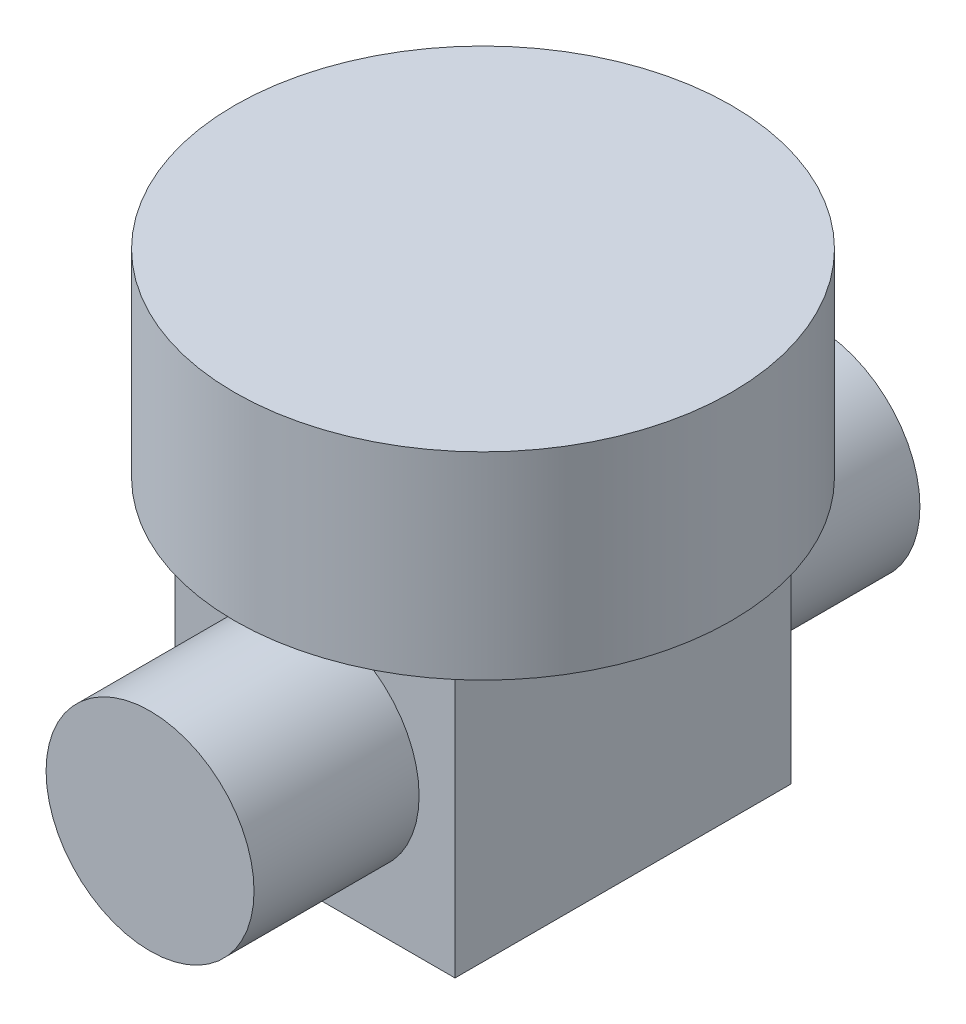
ISO-10303-21;
HEADER;
FILE_DESCRIPTION(('STEP AP214'),'2;1');
FILE_NAME('part.step','',(''),(''),'','','');
FILE_SCHEMA(('AUTOMOTIVE_DESIGN { 1 0 10303 214 1 1 1 1 }'));
ENDSEC;
DATA;
#1=APPLICATION_CONTEXT('core data for automotive mechanical design processes');
#2=APPLICATION_PROTOCOL_DEFINITION('international standard','automotive_design',2000,#1);
#3=PRODUCT_CONTEXT('',#1,'mechanical');
#4=PRODUCT('Part','Part','',(#3));
#5=PRODUCT_RELATED_PRODUCT_CATEGORY('part','',(#4));
#6=PRODUCT_DEFINITION_FORMATION('','',#4);
#7=PRODUCT_DEFINITION_CONTEXT('part definition',#1,'design');
#8=PRODUCT_DEFINITION('design','',#6,#7);
#9=PRODUCT_DEFINITION_SHAPE('','',#8);
#10=(LENGTH_UNIT() NAMED_UNIT(*) SI_UNIT(.MILLI.,.METRE.));
#11=(NAMED_UNIT(*) PLANE_ANGLE_UNIT() SI_UNIT($,.RADIAN.));
#12=(NAMED_UNIT(*) SI_UNIT($,.STERADIAN.) SOLID_ANGLE_UNIT());
#13=UNCERTAINTY_MEASURE_WITH_UNIT(LENGTH_MEASURE(1.E-05),#10,'distance_accuracy_value','');
#14=(GEOMETRIC_REPRESENTATION_CONTEXT(3) GLOBAL_UNCERTAINTY_ASSIGNED_CONTEXT((#13)) GLOBAL_UNIT_ASSIGNED_CONTEXT((#10,
#11,#12)) REPRESENTATION_CONTEXT('',''));
#15=CARTESIAN_POINT('',(0.,0.,0.));
#16=DIRECTION('',(0.,0.,1.));
#17=DIRECTION('',(1.,0.,0.));
#18=AXIS2_PLACEMENT_3D('',#15,#16,#17);
#19=CARTESIAN_POINT('',(-9.525,9.525,-11.43));
#20=DIRECTION('',(0.,0.,1.));
#21=DIRECTION('',(1.,0.,0.));
#22=AXIS2_PLACEMENT_3D('',#19,#20,#21);
#23=PLANE('',#22);
#24=DIRECTION('',(-1.,0.,0.));
#25=VECTOR('',#24,1.);
#26=CARTESIAN_POINT('',(-9.525,-9.525,-11.43));
#27=LINE('',#26,#25);
#28=CARTESIAN_POINT('',(9.525,-9.525,-11.43));
#29=VERTEX_POINT('',#28);
#30=CARTESIAN_POINT('',(-9.525,-9.525,-11.43));
#31=VERTEX_POINT('',#30);
#32=EDGE_CURVE('E104',#29,#31,#27,.T.);
#33=ORIENTED_EDGE('',*,*,#32,.T.);
#34=DIRECTION('',(0.,-1.,0.));
#35=VECTOR('',#34,1.);
#36=CARTESIAN_POINT('',(-9.525,9.525,-11.43));
#37=LINE('',#36,#35);
#38=CARTESIAN_POINT('',(-9.525,9.525,-11.43));
#39=VERTEX_POINT('',#38);
#40=EDGE_CURVE('E110',#39,#31,#37,.T.);
#41=ORIENTED_EDGE('',*,*,#40,.F.);
#42=DIRECTION('',(-1.,0.,0.));
#43=VECTOR('',#42,1.);
#44=CARTESIAN_POINT('',(-9.525,9.525,-11.43));
#45=LINE('',#44,#43);
#46=CARTESIAN_POINT('',(9.525,9.525,-11.43));
#47=VERTEX_POINT('',#46);
#48=EDGE_CURVE('E77',#47,#39,#45,.T.);
#49=ORIENTED_EDGE('',*,*,#48,.F.);
#50=DIRECTION('',(0.,-1.,0.));
#51=VECTOR('',#50,1.);
#52=CARTESIAN_POINT('',(9.525,9.525,-11.43));
#53=LINE('',#52,#51);
#54=EDGE_CURVE('E87',#47,#29,#53,.T.);
#55=ORIENTED_EDGE('',*,*,#54,.T.);
#56=EDGE_LOOP('',(#33,#41,#49,#55));
#57=FACE_BOUND('',#56,.T.);
#58=CARTESIAN_POINT('',(0.,0.,-11.43));
#59=DIRECTION('',(0.,0.,1.));
#60=DIRECTION('',(1.,0.,0.));
#61=AXIS2_PLACEMENT_3D('',#58,#59,#60);
#62=CIRCLE('',#61,7.08025);
#63=CARTESIAN_POINT('',(7.08025,0.,-11.43));
#64=VERTEX_POINT('',#63);
#65=EDGE_CURVE('E11',#64,#64,#62,.F.);
#66=ORIENTED_EDGE('',*,*,#65,.F.);
#67=EDGE_LOOP('',(#66));
#68=FACE_BOUND('',#67,.T.);
#69=ADVANCED_FACE('F32',(#57,#68),#23,.F.);
#70=CARTESIAN_POINT('',(-9.525,9.525,11.43));
#71=DIRECTION('',(0.,0.,-1.));
#72=DIRECTION('',(-1.,0.,0.));
#73=AXIS2_PLACEMENT_3D('',#70,#71,#72);
#74=PLANE('',#73);
#75=DIRECTION('',(1.,0.,0.));
#76=VECTOR('',#75,1.);
#77=CARTESIAN_POINT('',(-9.525,-9.525,11.43));
#78=LINE('',#77,#76);
#79=CARTESIAN_POINT('',(-9.525,-9.525,11.43));
#80=VERTEX_POINT('',#79);
#81=CARTESIAN_POINT('',(9.525,-9.525,11.43));
#82=VERTEX_POINT('',#81);
#83=EDGE_CURVE('E71',#80,#82,#78,.T.);
#84=ORIENTED_EDGE('',*,*,#83,.T.);
#85=DIRECTION('',(0.,-1.,0.));
#86=VECTOR('',#85,1.);
#87=CARTESIAN_POINT('',(9.525,9.525,11.43));
#88=LINE('',#87,#86);
#89=CARTESIAN_POINT('',(9.52499999999999,9.525,11.43));
#90=VERTEX_POINT('',#89);
#91=EDGE_CURVE('E85',#90,#82,#88,.T.);
#92=ORIENTED_EDGE('',*,*,#91,.F.);
#93=DIRECTION('',(1.,0.,0.));
#94=VECTOR('',#93,1.);
#95=CARTESIAN_POINT('',(-9.525,9.525,11.43));
#96=LINE('',#95,#94);
#97=CARTESIAN_POINT('',(-9.525,9.525,11.43));
#98=VERTEX_POINT('',#97);
#99=EDGE_CURVE('E93',#98,#90,#96,.T.);
#100=ORIENTED_EDGE('',*,*,#99,.F.);
#101=DIRECTION('',(0.,-1.,0.));
#102=VECTOR('',#101,1.);
#103=CARTESIAN_POINT('',(-9.525,9.525,11.43));
#104=LINE('',#103,#102);
#105=EDGE_CURVE('E50',#98,#80,#104,.T.);
#106=ORIENTED_EDGE('',*,*,#105,.T.);
#107=EDGE_LOOP('',(#84,#92,#100,#106));
#108=FACE_BOUND('',#107,.T.);
#109=CARTESIAN_POINT('',(0.,0.,11.43));
#110=DIRECTION('',(0.,0.,-1.));
#111=DIRECTION('',(-1.,0.,0.));
#112=AXIS2_PLACEMENT_3D('',#109,#110,#111);
#113=CIRCLE('',#112,7.08025);
#114=CARTESIAN_POINT('',(-7.08025,0.,11.43));
#115=VERTEX_POINT('',#114);
#116=EDGE_CURVE('E36',#115,#115,#113,.F.);
#117=ORIENTED_EDGE('',*,*,#116,.F.);
#118=EDGE_LOOP('',(#117));
#119=FACE_BOUND('',#118,.T.);
#120=ADVANCED_FACE('F91',(#108,#119),#74,.F.);
#121=CARTESIAN_POINT('',(9.525,9.525,11.43));
#122=DIRECTION('',(-1.,0.,0.));
#123=DIRECTION('',(0.,0.,1.));
#124=AXIS2_PLACEMENT_3D('',#121,#122,#123);
#125=PLANE('',#124);
#126=DIRECTION('',(0.,0.,-1.));
#127=VECTOR('',#126,1.);
#128=CARTESIAN_POINT('',(9.525,-9.525,11.43));
#129=LINE('',#128,#127);
#130=EDGE_CURVE('E102',#82,#29,#129,.T.);
#131=ORIENTED_EDGE('',*,*,#130,.T.);
#132=ORIENTED_EDGE('',*,*,#54,.F.);
#133=DIRECTION('',(0.,0.,-1.));
#134=VECTOR('',#133,1.);
#135=CARTESIAN_POINT('',(9.525,9.525,11.43));
#136=LINE('',#135,#134);
#137=EDGE_CURVE('E83',#90,#47,#136,.T.);
#138=ORIENTED_EDGE('',*,*,#137,.F.);
#139=ORIENTED_EDGE('',*,*,#91,.T.);
#140=EDGE_LOOP('',(#131,#132,#138,#139));
#141=FACE_BOUND('',#140,.T.);
#142=ADVANCED_FACE('F34',(#141),#125,.F.);
#143=CARTESIAN_POINT('',(-9.525,9.525,11.43));
#144=DIRECTION('',(1.,0.,0.));
#145=DIRECTION('',(0.,0.,-1.));
#146=AXIS2_PLACEMENT_3D('',#143,#144,#145);
#147=PLANE('',#146);
#148=DIRECTION('',(0.,0.,1.));
#149=VECTOR('',#148,1.);
#150=CARTESIAN_POINT('',(-9.525,-9.525,11.43));
#151=LINE('',#150,#149);
#152=EDGE_CURVE('E66',#31,#80,#151,.T.);
#153=ORIENTED_EDGE('',*,*,#152,.T.);
#154=ORIENTED_EDGE('',*,*,#105,.F.);
#155=DIRECTION('',(0.,0.,1.));
#156=VECTOR('',#155,1.);
#157=CARTESIAN_POINT('',(-9.525,9.525,11.43));
#158=LINE('',#157,#156);
#159=EDGE_CURVE('E97',#39,#98,#158,.T.);
#160=ORIENTED_EDGE('',*,*,#159,.F.);
#161=ORIENTED_EDGE('',*,*,#40,.T.);
#162=EDGE_LOOP('',(#153,#154,#160,#161));
#163=FACE_BOUND('',#162,.T.);
#164=ADVANCED_FACE('F121',(#163),#147,.F.);
#165=CARTESIAN_POINT('',(9.52499999999999,-9.525,-11.43));
#166=DIRECTION('',(0.,-1.,0.));
#167=DIRECTION('',(0.,0.,-1.));
#168=AXIS2_PLACEMENT_3D('',#165,#166,#167);
#169=PLANE('',#168);
#170=ORIENTED_EDGE('',*,*,#130,.F.);
#171=ORIENTED_EDGE('',*,*,#83,.F.);
#172=ORIENTED_EDGE('',*,*,#152,.F.);
#173=ORIENTED_EDGE('',*,*,#32,.F.);
#174=EDGE_LOOP('',(#170,#171,#172,#173));
#175=FACE_BOUND('',#174,.T.);
#176=ADVANCED_FACE('F124',(#175),#169,.T.);
#177=CARTESIAN_POINT('',(0.,9.525,0.));
#178=DIRECTION('',(0.,1.,0.));
#179=DIRECTION('',(0.,0.,1.));
#180=AXIS2_PLACEMENT_3D('',#177,#178,#179);
#181=PLANE('',#180);
#182=CARTESIAN_POINT('',(0.,9.525,0.));
#183=DIRECTION('',(0.,1.,0.));
#184=DIRECTION('',(0.,0.,1.));
#185=AXIS2_PLACEMENT_3D('',#182,#183,#184);
#186=CIRCLE('',#185,16.92275);
#187=CARTESIAN_POINT('',(0.,9.525,16.92275));
#188=VERTEX_POINT('',#187);
#189=EDGE_CURVE('E139',#188,#188,#186,.T.);
#190=ORIENTED_EDGE('',*,*,#189,.F.);
#191=EDGE_LOOP('',(#190));
#192=FACE_BOUND('',#191,.T.);
#193=ORIENTED_EDGE('',*,*,#99,.T.);
#194=ORIENTED_EDGE('',*,*,#137,.T.);
#195=ORIENTED_EDGE('',*,*,#48,.T.);
#196=ORIENTED_EDGE('',*,*,#159,.T.);
#197=EDGE_LOOP('',(#193,#194,#195,#196));
#198=FACE_BOUND('',#197,.T.);
#199=ADVANCED_FACE('F96',(#192,#198),#181,.F.);
#200=CARTESIAN_POINT('',(0.,22.987,0.));
#201=DIRECTION('',(0.,-1.,0.));
#202=DIRECTION('',(0.,0.,-1.));
#203=AXIS2_PLACEMENT_3D('',#200,#201,#202);
#204=CYLINDRICAL_SURFACE('',#203,16.92275);
#205=CARTESIAN_POINT('',(0.,22.987,0.));
#206=DIRECTION('',(0.,1.,0.));
#207=DIRECTION('',(0.,0.,1.));
#208=AXIS2_PLACEMENT_3D('',#205,#206,#207);
#209=CIRCLE('',#208,16.92275);
#210=CARTESIAN_POINT('',(0.,22.987,16.92275));
#211=VERTEX_POINT('',#210);
#212=EDGE_CURVE('E105',#211,#211,#209,.T.);
#213=ORIENTED_EDGE('',*,*,#212,.F.);
#214=EDGE_LOOP('',(#213));
#215=FACE_BOUND('',#214,.T.);
#216=ORIENTED_EDGE('',*,*,#189,.T.);
#217=EDGE_LOOP('',(#216));
#218=FACE_BOUND('',#217,.T.);
#219=ADVANCED_FACE('F134',(#215,#218),#204,.T.);
#220=CARTESIAN_POINT('',(0.,22.987,0.));
#221=DIRECTION('',(0.,1.,0.));
#222=DIRECTION('',(0.,0.,1.));
#223=AXIS2_PLACEMENT_3D('',#220,#221,#222);
#224=PLANE('',#223);
#225=ORIENTED_EDGE('',*,*,#212,.T.);
#226=EDGE_LOOP('',(#225));
#227=FACE_BOUND('',#226,.T.);
#228=ADVANCED_FACE('F162',(#227),#224,.T.);
#229=CARTESIAN_POINT('',(0.,0.,22.6695));
#230=DIRECTION('',(0.,0.,1.));
#231=DIRECTION('',(1.,0.,0.));
#232=AXIS2_PLACEMENT_3D('',#229,#230,#231);
#233=PLANE('',#232);
#234=CARTESIAN_POINT('',(0.,0.,22.6695));
#235=DIRECTION('',(0.,0.,1.));
#236=DIRECTION('',(1.,0.,0.));
#237=AXIS2_PLACEMENT_3D('',#234,#235,#236);
#238=CIRCLE('',#237,7.08025);
#239=CARTESIAN_POINT('',(7.08025,0.,22.6695));
#240=VERTEX_POINT('',#239);
#241=EDGE_CURVE('E142',#240,#240,#238,.T.);
#242=ORIENTED_EDGE('',*,*,#241,.T.);
#243=EDGE_LOOP('',(#242));
#244=FACE_BOUND('',#243,.T.);
#245=ADVANCED_FACE('F151',(#244),#233,.T.);
#246=CARTESIAN_POINT('',(0.,0.,22.6695));
#247=DIRECTION('',(0.,0.,-1.));
#248=DIRECTION('',(-1.,0.,0.));
#249=AXIS2_PLACEMENT_3D('',#246,#247,#248);
#250=CYLINDRICAL_SURFACE('',#249,7.08025);
#251=ORIENTED_EDGE('',*,*,#241,.F.);
#252=EDGE_LOOP('',(#251));
#253=FACE_BOUND('',#252,.T.);
#254=ORIENTED_EDGE('',*,*,#116,.T.);
#255=EDGE_LOOP('',(#254));
#256=FACE_BOUND('',#255,.T.);
#257=ADVANCED_FACE('F114',(#253,#256),#250,.T.);
#258=CARTESIAN_POINT('',(0.,0.,-22.6695));
#259=DIRECTION('',(0.,0.,1.));
#260=DIRECTION('',(1.,0.,0.));
#261=AXIS2_PLACEMENT_3D('',#258,#259,#260);
#262=CIRCLE('',#261,7.08025);
#263=CARTESIAN_POINT('',(7.08025,0.,-22.6695));
#264=VERTEX_POINT('',#263);
#265=EDGE_CURVE('E145',#264,#264,#262,.T.);
#266=ORIENTED_EDGE('',*,*,#265,.T.);
#267=EDGE_LOOP('',(#266));
#268=FACE_BOUND('',#267,.T.);
#269=ORIENTED_EDGE('',*,*,#65,.T.);
#270=EDGE_LOOP('',(#269));
#271=FACE_BOUND('',#270,.T.);
#272=ADVANCED_FACE('F154',(#268,#271),#250,.T.);
#273=CARTESIAN_POINT('',(0.,0.,-22.6695));
#274=DIRECTION('',(0.,0.,1.));
#275=DIRECTION('',(1.,0.,0.));
#276=AXIS2_PLACEMENT_3D('',#273,#274,#275);
#277=PLANE('',#276);
#278=ORIENTED_EDGE('',*,*,#265,.F.);
#279=EDGE_LOOP('',(#278));
#280=FACE_BOUND('',#279,.T.);
#281=ADVANCED_FACE('F160',(#280),#277,.F.);
#282=CLOSED_SHELL('',(#69,#120,#142,#164,#176,#199,#219,#228,#245,#257,#272,#281));
#283=MANIFOLD_SOLID_BREP('B2',#282);
#284=ADVANCED_BREP_SHAPE_REPRESENTATION('',(#18,#283),#14);
#285=SHAPE_DEFINITION_REPRESENTATION(#9,#284);
ENDSEC;
END-ISO-10303-21;
